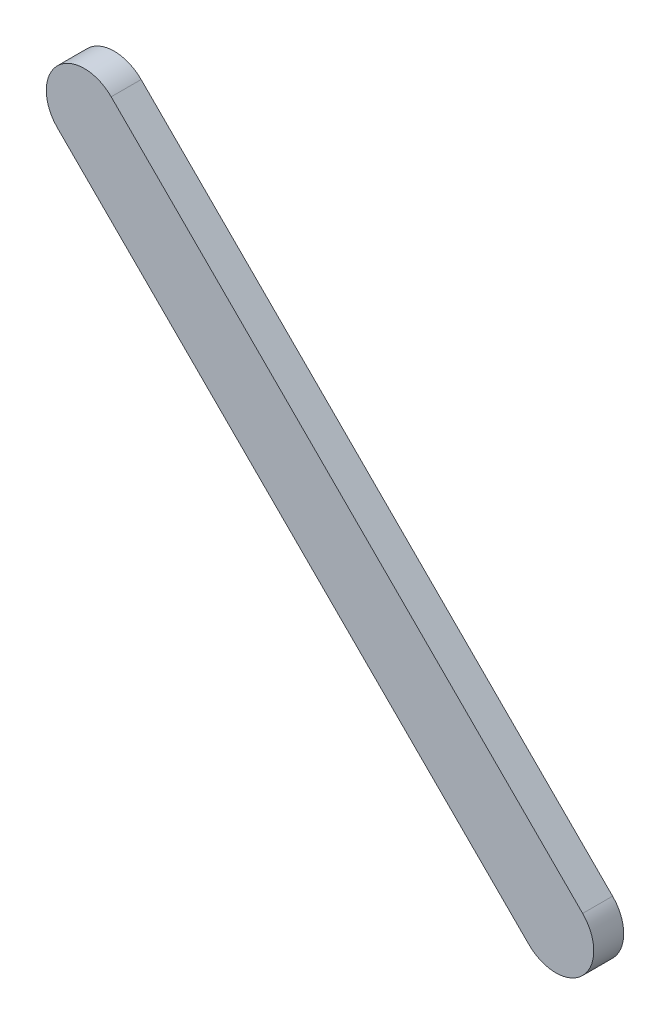
ISO-10303-21;
HEADER;
FILE_DESCRIPTION(('STEP AP214'),'2;1');
FILE_NAME('part.step','',(''),(''),'','','');
FILE_SCHEMA(('AUTOMOTIVE_DESIGN { 1 0 10303 214 1 1 1 1 }'));
ENDSEC;
DATA;
#1=APPLICATION_CONTEXT('core data for automotive mechanical design processes');
#2=APPLICATION_PROTOCOL_DEFINITION('international standard','automotive_design',2000,#1);
#3=PRODUCT_CONTEXT('',#1,'mechanical');
#4=PRODUCT('Part','Part','',(#3));
#5=PRODUCT_RELATED_PRODUCT_CATEGORY('part','',(#4));
#6=PRODUCT_DEFINITION_FORMATION('','',#4);
#7=PRODUCT_DEFINITION_CONTEXT('part definition',#1,'design');
#8=PRODUCT_DEFINITION('design','',#6,#7);
#9=PRODUCT_DEFINITION_SHAPE('','',#8);
#10=(LENGTH_UNIT() NAMED_UNIT(*) SI_UNIT(.MILLI.,.METRE.));
#11=(NAMED_UNIT(*) PLANE_ANGLE_UNIT() SI_UNIT($,.RADIAN.));
#12=(NAMED_UNIT(*) SI_UNIT($,.STERADIAN.) SOLID_ANGLE_UNIT());
#13=UNCERTAINTY_MEASURE_WITH_UNIT(LENGTH_MEASURE(1.E-05),#10,'distance_accuracy_value','');
#14=(GEOMETRIC_REPRESENTATION_CONTEXT(3) GLOBAL_UNCERTAINTY_ASSIGNED_CONTEXT((#13)) GLOBAL_UNIT_ASSIGNED_CONTEXT((#10,
#11,#12)) REPRESENTATION_CONTEXT('',''));
#15=CARTESIAN_POINT('',(0.,0.,0.));
#16=DIRECTION('',(0.,0.,1.));
#17=DIRECTION('',(1.,0.,0.));
#18=AXIS2_PLACEMENT_3D('',#15,#16,#17);
#19=CARTESIAN_POINT('',(106.2971966,69.41639406,0.));
#20=DIRECTION('',(0.707106781186549,0.707106781186546,0.));
#21=DIRECTION('',(0.707106781186546,-0.707106781186549,0.));
#22=AXIS2_PLACEMENT_3D('',#19,#20,#21);
#23=PLANE('',#22);
#24=DIRECTION('',(0.707106781186546,-0.707106781186549,0.));
#25=VECTOR('',#24,1.);
#26=CARTESIAN_POINT('',(106.2971966,69.41639406,0.1999996));
#27=LINE('',#26,#25);
#28=CARTESIAN_POINT('',(106.2971966,69.41639406,0.1999996));
#29=VERTEX_POINT('',#28);
#30=CARTESIAN_POINT('',(109.44679406,66.2667966,0.1999996));
#31=VERTEX_POINT('',#30);
#32=EDGE_CURVE('E11',#29,#31,#27,.T.);
#33=ORIENTED_EDGE('',*,*,#32,.F.);
#34=DIRECTION('',(0.,0.,1.));
#35=VECTOR('',#34,1.);
#36=CARTESIAN_POINT('',(106.2971966,69.41639406,0.));
#37=LINE('',#36,#35);
#38=CARTESIAN_POINT('',(106.2971966,69.41639406,0.));
#39=VERTEX_POINT('',#38);
#40=EDGE_CURVE('E24',#39,#29,#37,.T.);
#41=ORIENTED_EDGE('',*,*,#40,.F.);
#42=DIRECTION('',(0.707106781186546,-0.707106781186549,0.));
#43=VECTOR('',#42,1.);
#44=CARTESIAN_POINT('',(106.2971966,69.41639406,0.));
#45=LINE('',#44,#43);
#46=CARTESIAN_POINT('',(109.44679406,66.2667966,0.));
#47=VERTEX_POINT('',#46);
#48=EDGE_CURVE('E75',#39,#47,#45,.T.);
#49=ORIENTED_EDGE('',*,*,#48,.T.);
#50=DIRECTION('',(0.,0.,1.));
#51=VECTOR('',#50,1.);
#52=CARTESIAN_POINT('',(109.44679406,66.2667966,0.));
#53=LINE('',#52,#51);
#54=EDGE_CURVE('E37',#47,#31,#53,.T.);
#55=ORIENTED_EDGE('',*,*,#54,.T.);
#56=EDGE_LOOP('',(#33,#41,#49,#55));
#57=FACE_BOUND('',#56,.T.);
#58=ADVANCED_FACE('F17',(#57),#23,.F.);
#59=CARTESIAN_POINT('',(109.62639873,66.44640127,0.));
#60=DIRECTION('',(0.,0.,-1.));
#61=DIRECTION('',(-0.707106781186576,-0.70710678118652,0.));
#62=AXIS2_PLACEMENT_3D('',#59,#60,#61);
#63=CYLINDRICAL_SURFACE('',#62,0.253999360179542);
#64=CARTESIAN_POINT('',(109.62639873,66.44640127,0.1999996));
#65=DIRECTION('',(0.,0.,1.));
#66=DIRECTION('',(-0.707106781186576,-0.70710678118652,0.));
#67=AXIS2_PLACEMENT_3D('',#64,#65,#66);
#68=CIRCLE('',#67,0.253999360179542);
#69=CARTESIAN_POINT('',(109.8060034,66.62600594,0.1999996));
#70=VERTEX_POINT('',#69);
#71=EDGE_CURVE('E83',#31,#70,#68,.T.);
#72=ORIENTED_EDGE('',*,*,#71,.F.);
#73=ORIENTED_EDGE('',*,*,#54,.F.);
#74=CARTESIAN_POINT('',(109.62639873,66.44640127,0.));
#75=DIRECTION('',(0.,0.,1.));
#76=DIRECTION('',(-0.707106781186576,-0.70710678118652,0.));
#77=AXIS2_PLACEMENT_3D('',#74,#75,#76);
#78=CIRCLE('',#77,0.253999360179542);
#79=CARTESIAN_POINT('',(109.8060034,66.62600594,0.));
#80=VERTEX_POINT('',#79);
#81=EDGE_CURVE('E81',#47,#80,#78,.T.);
#82=ORIENTED_EDGE('',*,*,#81,.T.);
#83=DIRECTION('',(0.,0.,1.));
#84=VECTOR('',#83,1.);
#85=CARTESIAN_POINT('',(109.8060034,66.62600594,0.));
#86=LINE('',#85,#84);
#87=EDGE_CURVE('E67',#80,#70,#86,.T.);
#88=ORIENTED_EDGE('',*,*,#87,.T.);
#89=EDGE_LOOP('',(#72,#73,#82,#88));
#90=FACE_BOUND('',#89,.T.);
#91=ADVANCED_FACE('F89',(#90),#63,.T.);
#92=CARTESIAN_POINT('',(109.8060034,66.62600594,0.));
#93=DIRECTION('',(-0.707106781186546,-0.707106781186549,0.));
#94=DIRECTION('',(-0.707106781186549,0.707106781186546,0.));
#95=AXIS2_PLACEMENT_3D('',#92,#93,#94);
#96=PLANE('',#95);
#97=DIRECTION('',(-0.707106781186549,0.707106781186546,0.));
#98=VECTOR('',#97,1.);
#99=CARTESIAN_POINT('',(109.8060034,66.62600594,0.1999996));
#100=LINE('',#99,#98);
#101=CARTESIAN_POINT('',(106.65640594,69.7756034,0.1999996));
#102=VERTEX_POINT('',#101);
#103=EDGE_CURVE('E71',#70,#102,#100,.T.);
#104=ORIENTED_EDGE('',*,*,#103,.F.);
#105=ORIENTED_EDGE('',*,*,#87,.F.);
#106=DIRECTION('',(-0.707106781186549,0.707106781186546,0.));
#107=VECTOR('',#106,1.);
#108=CARTESIAN_POINT('',(109.8060034,66.62600594,0.));
#109=LINE('',#108,#107);
#110=CARTESIAN_POINT('',(106.65640594,69.7756034,0.));
#111=VERTEX_POINT('',#110);
#112=EDGE_CURVE('E63',#80,#111,#109,.T.);
#113=ORIENTED_EDGE('',*,*,#112,.T.);
#114=DIRECTION('',(0.,0.,1.));
#115=VECTOR('',#114,1.);
#116=CARTESIAN_POINT('',(106.65640594,69.7756034,0.));
#117=LINE('',#116,#115);
#118=EDGE_CURVE('E53',#111,#102,#117,.T.);
#119=ORIENTED_EDGE('',*,*,#118,.T.);
#120=EDGE_LOOP('',(#104,#105,#113,#119));
#121=FACE_BOUND('',#120,.T.);
#122=ADVANCED_FACE('F66',(#121),#96,.F.);
#123=CARTESIAN_POINT('',(106.47680127,69.59599873,0.));
#124=DIRECTION('',(0.,0.,-1.));
#125=DIRECTION('',(0.70710678118652,0.707106781186576,0.));
#126=AXIS2_PLACEMENT_3D('',#123,#124,#125);
#127=CYLINDRICAL_SURFACE('',#126,0.253999360179536);
#128=CARTESIAN_POINT('',(106.47680127,69.59599873,0.1999996));
#129=DIRECTION('',(0.,0.,1.));
#130=DIRECTION('',(0.70710678118652,0.707106781186576,0.));
#131=AXIS2_PLACEMENT_3D('',#128,#129,#130);
#132=CIRCLE('',#131,0.253999360179536);
#133=EDGE_CURVE('E59',#102,#29,#132,.T.);
#134=ORIENTED_EDGE('',*,*,#133,.F.);
#135=ORIENTED_EDGE('',*,*,#118,.F.);
#136=CARTESIAN_POINT('',(106.47680127,69.59599873,0.));
#137=DIRECTION('',(0.,0.,1.));
#138=DIRECTION('',(0.70710678118652,0.707106781186576,0.));
#139=AXIS2_PLACEMENT_3D('',#136,#137,#138);
#140=CIRCLE('',#139,0.253999360179536);
#141=EDGE_CURVE('E57',#111,#39,#140,.T.);
#142=ORIENTED_EDGE('',*,*,#141,.T.);
#143=ORIENTED_EDGE('',*,*,#40,.T.);
#144=EDGE_LOOP('',(#134,#135,#142,#143));
#145=FACE_BOUND('',#144,.T.);
#146=ADVANCED_FACE('F55',(#145),#127,.T.);
#147=CARTESIAN_POINT('',(106.2971966,69.41639406,0.));
#148=DIRECTION('',(0.,0.,-1.));
#149=DIRECTION('',(-1.,0.,0.));
#150=AXIS2_PLACEMENT_3D('',#147,#148,#149);
#151=PLANE('',#150);
#152=ORIENTED_EDGE('',*,*,#141,.F.);
#153=ORIENTED_EDGE('',*,*,#112,.F.);
#154=ORIENTED_EDGE('',*,*,#81,.F.);
#155=ORIENTED_EDGE('',*,*,#48,.F.);
#156=EDGE_LOOP('',(#152,#153,#154,#155));
#157=FACE_BOUND('',#156,.T.);
#158=ADVANCED_FACE('F74',(#157),#151,.T.);
#159=CARTESIAN_POINT('',(106.2971966,69.41639406,0.1999996));
#160=DIRECTION('',(0.,0.,-1.));
#161=DIRECTION('',(-1.,0.,0.));
#162=AXIS2_PLACEMENT_3D('',#159,#160,#161);
#163=PLANE('',#162);
#164=ORIENTED_EDGE('',*,*,#32,.T.);
#165=ORIENTED_EDGE('',*,*,#71,.T.);
#166=ORIENTED_EDGE('',*,*,#103,.T.);
#167=ORIENTED_EDGE('',*,*,#133,.T.);
#168=EDGE_LOOP('',(#164,#165,#166,#167));
#169=FACE_BOUND('',#168,.T.);
#170=ADVANCED_FACE('F91',(#169),#163,.F.);
#171=CLOSED_SHELL('',(#58,#91,#122,#146,#158,#170));
#172=MANIFOLD_SOLID_BREP('B1',#171);
#173=ADVANCED_BREP_SHAPE_REPRESENTATION('',(#18,#172),#14);
#174=SHAPE_DEFINITION_REPRESENTATION(#9,#173);
ENDSEC;
END-ISO-10303-21;
